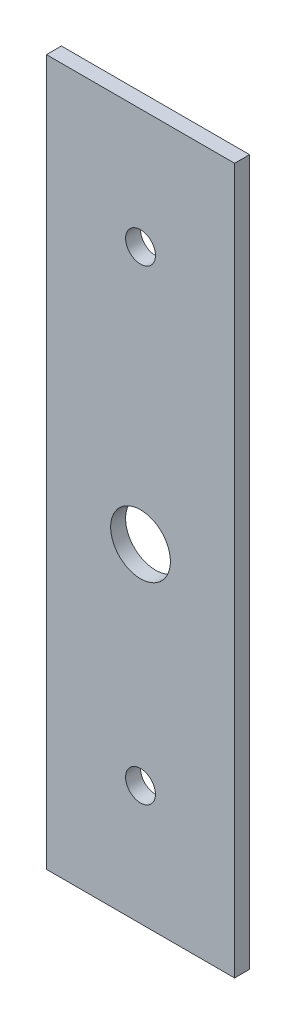
ISO-10303-21;
HEADER;
FILE_DESCRIPTION(('STEP AP214'),'2;1');
FILE_NAME('part.step','',(''),(''),'','','');
FILE_SCHEMA(('AUTOMOTIVE_DESIGN { 1 0 10303 214 1 1 1 1 }'));
ENDSEC;
DATA;
#1=APPLICATION_CONTEXT('core data for automotive mechanical design processes');
#2=APPLICATION_PROTOCOL_DEFINITION('international standard','automotive_design',2000,#1);
#3=PRODUCT_CONTEXT('',#1,'mechanical');
#4=PRODUCT('Part','Part','',(#3));
#5=PRODUCT_RELATED_PRODUCT_CATEGORY('part','',(#4));
#6=PRODUCT_DEFINITION_FORMATION('','',#4);
#7=PRODUCT_DEFINITION_CONTEXT('part definition',#1,'design');
#8=PRODUCT_DEFINITION('design','',#6,#7);
#9=PRODUCT_DEFINITION_SHAPE('','',#8);
#10=(LENGTH_UNIT() NAMED_UNIT(*) SI_UNIT(.MILLI.,.METRE.));
#11=(NAMED_UNIT(*) PLANE_ANGLE_UNIT() SI_UNIT($,.RADIAN.));
#12=(NAMED_UNIT(*) SI_UNIT($,.STERADIAN.) SOLID_ANGLE_UNIT());
#13=UNCERTAINTY_MEASURE_WITH_UNIT(LENGTH_MEASURE(1.E-05),#10,'distance_accuracy_value','');
#14=(GEOMETRIC_REPRESENTATION_CONTEXT(3) GLOBAL_UNCERTAINTY_ASSIGNED_CONTEXT((#13)) GLOBAL_UNIT_ASSIGNED_CONTEXT((#10,
#11,#12)) REPRESENTATION_CONTEXT('',''));
#15=CARTESIAN_POINT('',(0.,0.,0.));
#16=DIRECTION('',(0.,0.,1.));
#17=DIRECTION('',(1.,0.,0.));
#18=AXIS2_PLACEMENT_3D('',#15,#16,#17);
#19=CARTESIAN_POINT('',(40.,150.,-3.175));
#20=DIRECTION('',(0.,1.,0.));
#21=DIRECTION('',(0.,0.,1.));
#22=AXIS2_PLACEMENT_3D('',#19,#20,#21);
#23=PLANE('',#22);
#24=DIRECTION('',(-1.,0.,0.));
#25=VECTOR('',#24,1.);
#26=CARTESIAN_POINT('',(40.,150.,0.));
#27=LINE('',#26,#25);
#28=CARTESIAN_POINT('',(40.,150.,0.));
#29=VERTEX_POINT('',#28);
#30=CARTESIAN_POINT('',(0.,150.,0.));
#31=VERTEX_POINT('',#30);
#32=EDGE_CURVE('E106',#29,#31,#27,.T.);
#33=ORIENTED_EDGE('',*,*,#32,.F.);
#34=DIRECTION('',(0.,0.,1.));
#35=VECTOR('',#34,1.);
#36=CARTESIAN_POINT('',(40.,150.,-3.175));
#37=LINE('',#36,#35);
#38=CARTESIAN_POINT('',(40.,150.,-3.175));
#39=VERTEX_POINT('',#38);
#40=EDGE_CURVE('E11',#39,#29,#37,.T.);
#41=ORIENTED_EDGE('',*,*,#40,.F.);
#42=DIRECTION('',(-1.,0.,0.));
#43=VECTOR('',#42,1.);
#44=CARTESIAN_POINT('',(40.,150.,-3.175));
#45=LINE('',#44,#43);
#46=CARTESIAN_POINT('',(0.,150.,-3.175));
#47=VERTEX_POINT('',#46);
#48=EDGE_CURVE('E99',#39,#47,#45,.T.);
#49=ORIENTED_EDGE('',*,*,#48,.T.);
#50=DIRECTION('',(0.,0.,1.));
#51=VECTOR('',#50,1.);
#52=CARTESIAN_POINT('',(0.,150.,-3.175));
#53=LINE('',#52,#51);
#54=EDGE_CURVE('E44',#47,#31,#53,.T.);
#55=ORIENTED_EDGE('',*,*,#54,.T.);
#56=EDGE_LOOP('',(#33,#41,#49,#55));
#57=FACE_BOUND('',#56,.T.);
#58=ADVANCED_FACE('F41',(#57),#23,.T.);
#59=CARTESIAN_POINT('',(40.,0.,-3.175));
#60=DIRECTION('',(1.,0.,0.));
#61=DIRECTION('',(0.,1.,0.));
#62=AXIS2_PLACEMENT_3D('',#59,#60,#61);
#63=PLANE('',#62);
#64=DIRECTION('',(0.,1.,0.));
#65=VECTOR('',#64,1.);
#66=CARTESIAN_POINT('',(40.,0.,0.));
#67=LINE('',#66,#65);
#68=CARTESIAN_POINT('',(40.,0.,0.));
#69=VERTEX_POINT('',#68);
#70=EDGE_CURVE('E101',#69,#29,#67,.T.);
#71=ORIENTED_EDGE('',*,*,#70,.F.);
#72=DIRECTION('',(0.,0.,1.));
#73=VECTOR('',#72,1.);
#74=CARTESIAN_POINT('',(40.,0.,-3.175));
#75=LINE('',#74,#73);
#76=CARTESIAN_POINT('',(40.,0.,-3.175));
#77=VERTEX_POINT('',#76);
#78=EDGE_CURVE('E50',#77,#69,#75,.T.);
#79=ORIENTED_EDGE('',*,*,#78,.F.);
#80=DIRECTION('',(0.,1.,0.));
#81=VECTOR('',#80,1.);
#82=CARTESIAN_POINT('',(40.,0.,-3.175));
#83=LINE('',#82,#81);
#84=EDGE_CURVE('E96',#77,#39,#83,.T.);
#85=ORIENTED_EDGE('',*,*,#84,.T.);
#86=ORIENTED_EDGE('',*,*,#40,.T.);
#87=EDGE_LOOP('',(#71,#79,#85,#86));
#88=FACE_BOUND('',#87,.T.);
#89=ADVANCED_FACE('F117',(#88),#63,.T.);
#90=CARTESIAN_POINT('',(0.,0.,-3.175));
#91=DIRECTION('',(0.,-1.,0.));
#92=DIRECTION('',(1.,0.,0.));
#93=AXIS2_PLACEMENT_3D('',#90,#91,#92);
#94=PLANE('',#93);
#95=DIRECTION('',(1.,0.,0.));
#96=VECTOR('',#95,1.);
#97=CARTESIAN_POINT('',(0.,0.,0.));
#98=LINE('',#97,#96);
#99=CARTESIAN_POINT('',(0.,0.,0.));
#100=VERTEX_POINT('',#99);
#101=EDGE_CURVE('E91',#100,#69,#98,.T.);
#102=ORIENTED_EDGE('',*,*,#101,.F.);
#103=DIRECTION('',(0.,0.,1.));
#104=VECTOR('',#103,1.);
#105=CARTESIAN_POINT('',(0.,0.,-3.175));
#106=LINE('',#105,#104);
#107=CARTESIAN_POINT('',(0.,0.,-3.175));
#108=VERTEX_POINT('',#107);
#109=EDGE_CURVE('E86',#108,#100,#106,.T.);
#110=ORIENTED_EDGE('',*,*,#109,.F.);
#111=DIRECTION('',(1.,0.,0.));
#112=VECTOR('',#111,1.);
#113=CARTESIAN_POINT('',(0.,0.,-3.175));
#114=LINE('',#113,#112);
#115=EDGE_CURVE('E89',#108,#77,#114,.T.);
#116=ORIENTED_EDGE('',*,*,#115,.T.);
#117=ORIENTED_EDGE('',*,*,#78,.T.);
#118=EDGE_LOOP('',(#102,#110,#116,#117));
#119=FACE_BOUND('',#118,.T.);
#120=ADVANCED_FACE('F88',(#119),#94,.T.);
#121=CARTESIAN_POINT('',(0.,150.,-3.175));
#122=DIRECTION('',(-1.,0.,0.));
#123=DIRECTION('',(0.,-1.,0.));
#124=AXIS2_PLACEMENT_3D('',#121,#122,#123);
#125=PLANE('',#124);
#126=DIRECTION('',(0.,-1.,0.));
#127=VECTOR('',#126,1.);
#128=CARTESIAN_POINT('',(0.,150.,0.));
#129=LINE('',#128,#127);
#130=EDGE_CURVE('E109',#31,#100,#129,.T.);
#131=ORIENTED_EDGE('',*,*,#130,.F.);
#132=ORIENTED_EDGE('',*,*,#54,.F.);
#133=DIRECTION('',(0.,-1.,0.));
#134=VECTOR('',#133,1.);
#135=CARTESIAN_POINT('',(0.,150.,-3.175));
#136=LINE('',#135,#134);
#137=EDGE_CURVE('E95',#47,#108,#136,.T.);
#138=ORIENTED_EDGE('',*,*,#137,.T.);
#139=ORIENTED_EDGE('',*,*,#109,.T.);
#140=EDGE_LOOP('',(#131,#132,#138,#139));
#141=FACE_BOUND('',#140,.T.);
#142=ADVANCED_FACE('F98',(#141),#125,.T.);
#143=CARTESIAN_POINT('',(0.,0.,-3.175));
#144=DIRECTION('',(0.,0.,1.));
#145=DIRECTION('',(1.,0.,0.));
#146=AXIS2_PLACEMENT_3D('',#143,#144,#145);
#147=PLANE('',#146);
#148=CARTESIAN_POINT('',(20.,124.6,-3.175));
#149=DIRECTION('',(0.,0.,1.));
#150=DIRECTION('',(1.,0.,0.));
#151=AXIS2_PLACEMENT_3D('',#148,#149,#150);
#152=CIRCLE('',#151,3.175);
#153=CARTESIAN_POINT('',(23.175,124.6,-3.175));
#154=VERTEX_POINT('',#153);
#155=EDGE_CURVE('E154',#154,#154,#152,.T.);
#156=ORIENTED_EDGE('',*,*,#155,.T.);
#157=EDGE_LOOP('',(#156));
#158=FACE_BOUND('',#157,.T.);
#159=CARTESIAN_POINT('',(20.,25.4,-3.175));
#160=DIRECTION('',(0.,0.,1.));
#161=DIRECTION('',(1.,0.,0.));
#162=AXIS2_PLACEMENT_3D('',#159,#160,#161);
#163=CIRCLE('',#162,3.175);
#164=CARTESIAN_POINT('',(23.175,25.4,-3.175));
#165=VERTEX_POINT('',#164);
#166=EDGE_CURVE('E162',#165,#165,#163,.T.);
#167=ORIENTED_EDGE('',*,*,#166,.T.);
#168=EDGE_LOOP('',(#167));
#169=FACE_BOUND('',#168,.T.);
#170=CARTESIAN_POINT('',(20.,69.85,-3.175));
#171=DIRECTION('',(0.,0.,1.));
#172=DIRECTION('',(1.,0.,0.));
#173=AXIS2_PLACEMENT_3D('',#170,#171,#172);
#174=CIRCLE('',#173,6.35);
#175=CARTESIAN_POINT('',(26.35,69.85,-3.175));
#176=VERTEX_POINT('',#175);
#177=EDGE_CURVE('E110',#176,#176,#174,.T.);
#178=ORIENTED_EDGE('',*,*,#177,.T.);
#179=EDGE_LOOP('',(#178));
#180=FACE_BOUND('',#179,.T.);
#181=ORIENTED_EDGE('',*,*,#48,.F.);
#182=ORIENTED_EDGE('',*,*,#84,.F.);
#183=ORIENTED_EDGE('',*,*,#115,.F.);
#184=ORIENTED_EDGE('',*,*,#137,.F.);
#185=EDGE_LOOP('',(#181,#182,#183,#184));
#186=FACE_BOUND('',#185,.T.);
#187=ADVANCED_FACE('F94',(#158,#169,#180,#186),#147,.F.);
#188=CARTESIAN_POINT('',(0.,0.,0.));
#189=DIRECTION('',(0.,0.,1.));
#190=DIRECTION('',(1.,0.,0.));
#191=AXIS2_PLACEMENT_3D('',#188,#189,#190);
#192=PLANE('',#191);
#193=CARTESIAN_POINT('',(20.,124.6,0.));
#194=DIRECTION('',(0.,0.,1.));
#195=DIRECTION('',(1.,0.,0.));
#196=AXIS2_PLACEMENT_3D('',#193,#194,#195);
#197=CIRCLE('',#196,3.175);
#198=CARTESIAN_POINT('',(23.175,124.6,0.));
#199=VERTEX_POINT('',#198);
#200=EDGE_CURVE('E157',#199,#199,#197,.T.);
#201=ORIENTED_EDGE('',*,*,#200,.F.);
#202=EDGE_LOOP('',(#201));
#203=FACE_BOUND('',#202,.T.);
#204=CARTESIAN_POINT('',(20.,25.4,0.));
#205=DIRECTION('',(0.,0.,1.));
#206=DIRECTION('',(1.,0.,0.));
#207=AXIS2_PLACEMENT_3D('',#204,#205,#206);
#208=CIRCLE('',#207,3.175);
#209=CARTESIAN_POINT('',(23.175,25.4,0.));
#210=VERTEX_POINT('',#209);
#211=EDGE_CURVE('E159',#210,#210,#208,.T.);
#212=ORIENTED_EDGE('',*,*,#211,.F.);
#213=EDGE_LOOP('',(#212));
#214=FACE_BOUND('',#213,.T.);
#215=CARTESIAN_POINT('',(20.,69.85,0.));
#216=DIRECTION('',(0.,0.,1.));
#217=DIRECTION('',(1.,0.,0.));
#218=AXIS2_PLACEMENT_3D('',#215,#216,#217);
#219=CIRCLE('',#218,6.35);
#220=CARTESIAN_POINT('',(26.35,69.85,0.));
#221=VERTEX_POINT('',#220);
#222=EDGE_CURVE('E165',#221,#221,#219,.T.);
#223=ORIENTED_EDGE('',*,*,#222,.F.);
#224=EDGE_LOOP('',(#223));
#225=FACE_BOUND('',#224,.T.);
#226=ORIENTED_EDGE('',*,*,#32,.T.);
#227=ORIENTED_EDGE('',*,*,#130,.T.);
#228=ORIENTED_EDGE('',*,*,#101,.T.);
#229=ORIENTED_EDGE('',*,*,#70,.T.);
#230=EDGE_LOOP('',(#226,#227,#228,#229));
#231=FACE_BOUND('',#230,.T.);
#232=ADVANCED_FACE('F116',(#203,#214,#225,#231),#192,.T.);
#233=CARTESIAN_POINT('',(20.,69.85,-3.175));
#234=DIRECTION('',(0.,0.,1.));
#235=DIRECTION('',(1.,0.,0.));
#236=AXIS2_PLACEMENT_3D('',#233,#234,#235);
#237=CYLINDRICAL_SURFACE('',#236,6.35);
#238=ORIENTED_EDGE('',*,*,#177,.F.);
#239=EDGE_LOOP('',(#238));
#240=FACE_BOUND('',#239,.T.);
#241=ORIENTED_EDGE('',*,*,#222,.T.);
#242=EDGE_LOOP('',(#241));
#243=FACE_BOUND('',#242,.T.);
#244=ADVANCED_FACE('F135',(#240,#243),#237,.F.);
#245=CARTESIAN_POINT('',(20.,25.4,-3.175));
#246=DIRECTION('',(0.,0.,1.));
#247=DIRECTION('',(1.,0.,0.));
#248=AXIS2_PLACEMENT_3D('',#245,#246,#247);
#249=CYLINDRICAL_SURFACE('',#248,3.175);
#250=ORIENTED_EDGE('',*,*,#166,.F.);
#251=EDGE_LOOP('',(#250));
#252=FACE_BOUND('',#251,.T.);
#253=ORIENTED_EDGE('',*,*,#211,.T.);
#254=EDGE_LOOP('',(#253));
#255=FACE_BOUND('',#254,.T.);
#256=ADVANCED_FACE('F142',(#252,#255),#249,.F.);
#257=CARTESIAN_POINT('',(20.,124.6,-3.175));
#258=DIRECTION('',(0.,0.,1.));
#259=DIRECTION('',(1.,0.,0.));
#260=AXIS2_PLACEMENT_3D('',#257,#258,#259);
#261=CYLINDRICAL_SURFACE('',#260,3.175);
#262=ORIENTED_EDGE('',*,*,#155,.F.);
#263=EDGE_LOOP('',(#262));
#264=FACE_BOUND('',#263,.T.);
#265=ORIENTED_EDGE('',*,*,#200,.T.);
#266=EDGE_LOOP('',(#265));
#267=FACE_BOUND('',#266,.T.);
#268=ADVANCED_FACE('F146',(#264,#267),#261,.F.);
#269=CLOSED_SHELL('',(#58,#89,#120,#142,#187,#232,#244,#256,#268));
#270=MANIFOLD_SOLID_BREP('B2',#269);
#271=ADVANCED_BREP_SHAPE_REPRESENTATION('',(#18,#270),#14);
#272=SHAPE_DEFINITION_REPRESENTATION(#9,#271);
ENDSEC;
END-ISO-10303-21;
